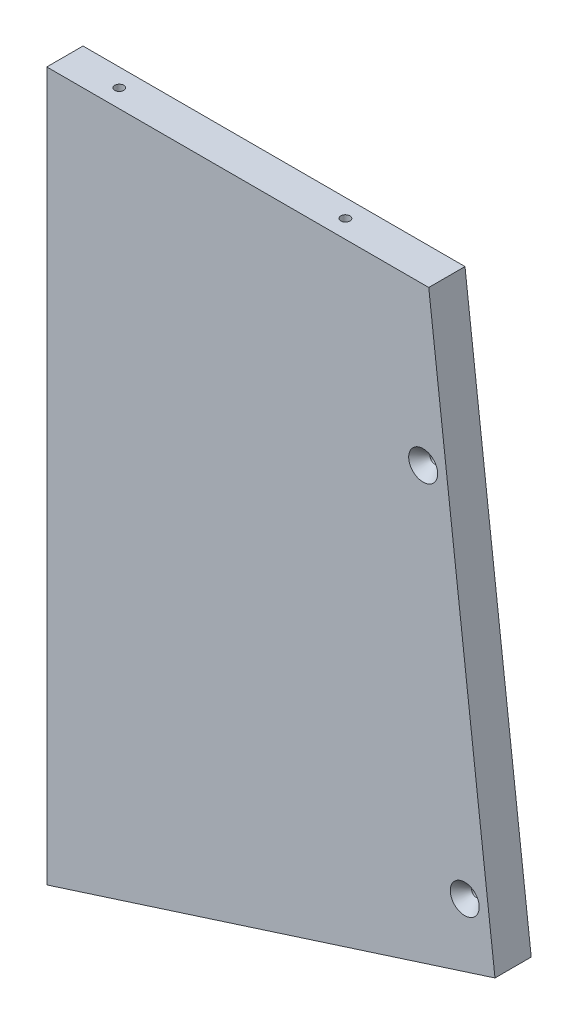
ISO-10303-21;
HEADER;
FILE_DESCRIPTION(('STEP AP214'),'2;1');
FILE_NAME('part.step','',(''),(''),'','','');
FILE_SCHEMA(('AUTOMOTIVE_DESIGN { 1 0 10303 214 1 1 1 1 }'));
ENDSEC;
DATA;
#1=APPLICATION_CONTEXT('core data for automotive mechanical design processes');
#2=APPLICATION_PROTOCOL_DEFINITION('international standard','automotive_design',2000,#1);
#3=PRODUCT_CONTEXT('',#1,'mechanical');
#4=PRODUCT('Part','Part','',(#3));
#5=PRODUCT_RELATED_PRODUCT_CATEGORY('part','',(#4));
#6=PRODUCT_DEFINITION_FORMATION('','',#4);
#7=PRODUCT_DEFINITION_CONTEXT('part definition',#1,'design');
#8=PRODUCT_DEFINITION('design','',#6,#7);
#9=PRODUCT_DEFINITION_SHAPE('','',#8);
#10=(LENGTH_UNIT() NAMED_UNIT(*) SI_UNIT(.MILLI.,.METRE.));
#11=(NAMED_UNIT(*) PLANE_ANGLE_UNIT() SI_UNIT($,.RADIAN.));
#12=(NAMED_UNIT(*) SI_UNIT($,.STERADIAN.) SOLID_ANGLE_UNIT());
#13=UNCERTAINTY_MEASURE_WITH_UNIT(LENGTH_MEASURE(1.E-05),#10,'distance_accuracy_value','');
#14=(GEOMETRIC_REPRESENTATION_CONTEXT(3) GLOBAL_UNCERTAINTY_ASSIGNED_CONTEXT((#13)) GLOBAL_UNIT_ASSIGNED_CONTEXT((#10,
#11,#12)) REPRESENTATION_CONTEXT('',''));
#15=CARTESIAN_POINT('',(0.,0.,0.));
#16=DIRECTION('',(0.,0.,1.));
#17=DIRECTION('',(1.,0.,0.));
#18=AXIS2_PLACEMENT_3D('',#15,#16,#17);
#19=CARTESIAN_POINT('',(-64.9774169834746,-197.96604829264,-12.7));
#20=DIRECTION('',(0.993195579602869,0.11645832154604,0.));
#21=DIRECTION('',(-0.11645832154604,0.993195579602869,0.));
#22=AXIS2_PLACEMENT_3D('',#19,#20,#21);
#23=PLANE('',#22);
#24=DIRECTION('',(-0.11645832154604,0.993195579602869,0.));
#25=VECTOR('',#24,1.);
#26=CARTESIAN_POINT('',(-64.9774169834746,-197.96604829264,0.));
#27=LINE('',#26,#25);
#28=CARTESIAN_POINT('',(-64.9774169834746,-197.96604829264,0.));
#29=VERTEX_POINT('',#28);
#30=CARTESIAN_POINT('',(-88.1901599524693,1.09287578986539E-13,0.));
#31=VERTEX_POINT('',#30);
#32=EDGE_CURVE('E160',#29,#31,#27,.T.);
#33=ORIENTED_EDGE('',*,*,#32,.F.);
#34=DIRECTION('',(0.,0.,1.));
#35=VECTOR('',#34,1.);
#36=CARTESIAN_POINT('',(-64.9774169834746,-197.96604829264,-12.7));
#37=LINE('',#36,#35);
#38=CARTESIAN_POINT('',(-64.9774169834746,-197.96604829264,-12.7));
#39=VERTEX_POINT('',#38);
#40=EDGE_CURVE('E41',#39,#29,#37,.T.);
#41=ORIENTED_EDGE('',*,*,#40,.F.);
#42=DIRECTION('',(-0.11645832154604,0.993195579602869,0.));
#43=VECTOR('',#42,1.);
#44=CARTESIAN_POINT('',(-64.9774169834746,-197.96604829264,-12.7));
#45=LINE('',#44,#43);
#46=CARTESIAN_POINT('',(-88.1901599524693,1.09287578986539E-13,-12.7));
#47=VERTEX_POINT('',#46);
#48=EDGE_CURVE('E150',#39,#47,#45,.T.);
#49=ORIENTED_EDGE('',*,*,#48,.T.);
#50=DIRECTION('',(0.,0.,1.));
#51=VECTOR('',#50,1.);
#52=CARTESIAN_POINT('',(-88.1901599524693,1.09287578986539E-13,-12.7));
#53=LINE('',#52,#51);
#54=EDGE_CURVE('E80',#47,#31,#53,.T.);
#55=ORIENTED_EDGE('',*,*,#54,.T.);
#56=EDGE_LOOP('',(#33,#41,#49,#55));
#57=FACE_BOUND('',#56,.T.);
#58=ADVANCED_FACE('F33',(#57),#23,.T.);
#59=CARTESIAN_POINT('',(-64.9774169834746,-197.96604829264,-12.7));
#60=DIRECTION('',(0.304884492171613,-0.952389335531041,0.));
#61=DIRECTION('',(0.952389335531041,0.304884492171613,0.));
#62=AXIS2_PLACEMENT_3D('',#59,#60,#61);
#63=PLANE('',#62);
#64=CARTESIAN_POINT('',(-104.122442077063,-210.497384639502,-6.35000000000019));
#65=DIRECTION('',(0.304884492171613,-0.952389335531041,0.));
#66=DIRECTION('',(0.952389335531041,0.304884492171613,0.));
#67=AXIS2_PLACEMENT_3D('',#64,#65,#66);
#68=CIRCLE('',#67,1.5875);
#69=CARTESIAN_POINT('',(-102.610524006908,-210.013380508179,-6.35000000000019));
#70=VERTEX_POINT('',#69);
#71=EDGE_CURVE('E36',#70,#70,#68,.T.);
#72=ORIENTED_EDGE('',*,*,#71,.F.);
#73=EDGE_LOOP('',(#72));
#74=FACE_BOUND('',#73,.T.);
#75=CARTESIAN_POINT('',(-197.286410666661,-240.321583832465,-6.35000000000022));
#76=DIRECTION('',(0.304884492171613,-0.952389335531041,0.));
#77=DIRECTION('',(0.952389335531041,0.304884492171613,0.));
#78=AXIS2_PLACEMENT_3D('',#75,#76,#77);
#79=CIRCLE('',#78,1.5875);
#80=CARTESIAN_POINT('',(-195.774492596505,-239.837579701142,-6.35000000000022));
#81=VERTEX_POINT('',#80);
#82=EDGE_CURVE('E117',#81,#81,#79,.T.);
#83=ORIENTED_EDGE('',*,*,#82,.F.);
#84=EDGE_LOOP('',(#83));
#85=FACE_BOUND('',#84,.T.);
#86=DIRECTION('',(0.952389335531041,0.304884492171613,0.));
#87=VECTOR('',#86,1.);
#88=CARTESIAN_POINT('',(-64.9774169834746,-197.96604829264,0.));
#89=LINE('',#88,#87);
#90=CARTESIAN_POINT('',(-222.05296718065,-248.249999999995,0.));
#91=VERTEX_POINT('',#90);
#92=EDGE_CURVE('E153',#91,#29,#89,.T.);
#93=ORIENTED_EDGE('',*,*,#92,.F.);
#94=DIRECTION('',(0.,0.,1.));
#95=VECTOR('',#94,1.);
#96=CARTESIAN_POINT('',(-222.05296718065,-248.249999999995,-12.7));
#97=LINE('',#96,#95);
#98=CARTESIAN_POINT('',(-222.05296718065,-248.249999999995,-12.7));
#99=VERTEX_POINT('',#98);
#100=EDGE_CURVE('E172',#99,#91,#97,.T.);
#101=ORIENTED_EDGE('',*,*,#100,.F.);
#102=DIRECTION('',(0.952389335531041,0.304884492171613,0.));
#103=VECTOR('',#102,1.);
#104=CARTESIAN_POINT('',(-64.9774169834746,-197.96604829264,-12.7));
#105=LINE('',#104,#103);
#106=EDGE_CURVE('E158',#99,#39,#105,.T.);
#107=ORIENTED_EDGE('',*,*,#106,.T.);
#108=ORIENTED_EDGE('',*,*,#40,.T.);
#109=EDGE_LOOP('',(#93,#101,#107,#108));
#110=FACE_BOUND('',#109,.T.);
#111=ADVANCED_FACE('F248',(#74,#85,#110),#63,.T.);
#112=CARTESIAN_POINT('',(-222.05296718065,-248.249999999995,-12.7));
#113=DIRECTION('',(-1.,0.,0.));
#114=DIRECTION('',(0.,-1.,0.));
#115=AXIS2_PLACEMENT_3D('',#112,#113,#114);
#116=PLANE('',#115);
#117=CARTESIAN_POINT('',(-222.05296718065,-227.298574490786,-6.35000000010183));
#118=DIRECTION('',(-1.,0.,0.));
#119=DIRECTION('',(0.,-1.,0.));
#120=AXIS2_PLACEMENT_3D('',#117,#118,#119);
#121=CIRCLE('',#120,1.58749999999999);
#122=CARTESIAN_POINT('',(-222.05296718065,-228.886074490786,-6.35000000010183));
#123=VERTEX_POINT('',#122);
#124=EDGE_CURVE('E145',#123,#123,#121,.T.);
#125=ORIENTED_EDGE('',*,*,#124,.F.);
#126=EDGE_LOOP('',(#125));
#127=FACE_BOUND('',#126,.T.);
#128=CARTESIAN_POINT('',(-222.05296718065,-55.2485744907911,-6.35000000010183));
#129=DIRECTION('',(-1.,0.,0.));
#130=DIRECTION('',(0.,-1.,0.));
#131=AXIS2_PLACEMENT_3D('',#128,#129,#130);
#132=CIRCLE('',#131,1.5875);
#133=CARTESIAN_POINT('',(-222.05296718065,-56.8360744907911,-6.35000000010183));
#134=VERTEX_POINT('',#133);
#135=EDGE_CURVE('E149',#134,#134,#132,.T.);
#136=ORIENTED_EDGE('',*,*,#135,.F.);
#137=EDGE_LOOP('',(#136));
#138=FACE_BOUND('',#137,.T.);
#139=DIRECTION('',(0.,-1.,0.));
#140=VECTOR('',#139,1.);
#141=CARTESIAN_POINT('',(-222.05296718065,-248.249999999995,0.));
#142=LINE('',#141,#140);
#143=CARTESIAN_POINT('',(-222.05296718065,0.,0.));
#144=VERTEX_POINT('',#143);
#145=EDGE_CURVE('E166',#144,#91,#142,.T.);
#146=ORIENTED_EDGE('',*,*,#145,.F.);
#147=DIRECTION('',(0.,0.,1.));
#148=VECTOR('',#147,1.);
#149=CARTESIAN_POINT('',(-222.05296718065,0.,-12.7));
#150=LINE('',#149,#148);
#151=CARTESIAN_POINT('',(-222.05296718065,0.,-12.7));
#152=VERTEX_POINT('',#151);
#153=EDGE_CURVE('E174',#152,#144,#150,.T.);
#154=ORIENTED_EDGE('',*,*,#153,.F.);
#155=DIRECTION('',(0.,-1.,0.));
#156=VECTOR('',#155,1.);
#157=CARTESIAN_POINT('',(-222.05296718065,-248.249999999995,-12.7));
#158=LINE('',#157,#156);
#159=EDGE_CURVE('E155',#152,#99,#158,.T.);
#160=ORIENTED_EDGE('',*,*,#159,.T.);
#161=ORIENTED_EDGE('',*,*,#100,.T.);
#162=EDGE_LOOP('',(#146,#154,#160,#161));
#163=FACE_BOUND('',#162,.T.);
#164=ADVANCED_FACE('F252',(#127,#138,#163),#116,.T.);
#165=CARTESIAN_POINT('',(-88.1901599524693,1.09287578986539E-13,-12.7));
#166=DIRECTION('',(0.,1.,0.));
#167=DIRECTION('',(-1.,0.,0.));
#168=AXIS2_PLACEMENT_3D('',#165,#166,#167);
#169=PLANE('',#168);
#170=CARTESIAN_POINT('',(-203.002967180666,0.,-6.34999999989857));
#171=DIRECTION('',(0.,1.,0.));
#172=DIRECTION('',(-1.,0.,0.));
#173=AXIS2_PLACEMENT_3D('',#170,#171,#172);
#174=CIRCLE('',#173,1.58749999999999);
#175=CARTESIAN_POINT('',(-204.590467180666,0.,-6.34999999989857));
#176=VERTEX_POINT('',#175);
#177=EDGE_CURVE('E123',#176,#176,#174,.T.);
#178=ORIENTED_EDGE('',*,*,#177,.F.);
#179=EDGE_LOOP('',(#178));
#180=FACE_BOUND('',#179,.T.);
#181=CARTESIAN_POINT('',(-123.747327392634,0.,-6.34999999989857));
#182=DIRECTION('',(0.,1.,0.));
#183=DIRECTION('',(-1.,0.,0.));
#184=AXIS2_PLACEMENT_3D('',#181,#182,#183);
#185=CIRCLE('',#184,1.5875);
#186=CARTESIAN_POINT('',(-125.334827392634,0.,-6.34999999989857));
#187=VERTEX_POINT('',#186);
#188=EDGE_CURVE('E127',#187,#187,#185,.T.);
#189=ORIENTED_EDGE('',*,*,#188,.F.);
#190=EDGE_LOOP('',(#189));
#191=FACE_BOUND('',#190,.T.);
#192=DIRECTION('',(-1.,0.,0.));
#193=VECTOR('',#192,1.);
#194=CARTESIAN_POINT('',(-88.1901599524693,1.09287578986539E-13,0.));
#195=LINE('',#194,#193);
#196=EDGE_CURVE('E163',#31,#144,#195,.T.);
#197=ORIENTED_EDGE('',*,*,#196,.F.);
#198=ORIENTED_EDGE('',*,*,#54,.F.);
#199=DIRECTION('',(-1.,0.,0.));
#200=VECTOR('',#199,1.);
#201=CARTESIAN_POINT('',(-88.1901599524693,1.09287578986539E-13,-12.7));
#202=LINE('',#201,#200);
#203=EDGE_CURVE('E152',#47,#152,#202,.T.);
#204=ORIENTED_EDGE('',*,*,#203,.T.);
#205=ORIENTED_EDGE('',*,*,#153,.T.);
#206=EDGE_LOOP('',(#197,#198,#204,#205));
#207=FACE_BOUND('',#206,.T.);
#208=ADVANCED_FACE('F263',(#180,#191,#207),#169,.T.);
#209=CARTESIAN_POINT('',(0.,0.,-12.7));
#210=DIRECTION('',(0.,0.,1.));
#211=DIRECTION('',(1.,0.,0.));
#212=AXIS2_PLACEMENT_3D('',#209,#210,#211);
#213=PLANE('',#212);
#214=CARTESIAN_POINT('',(-75.5766743949892,-179.246549529775,-12.7));
#215=DIRECTION('',(0.,0.,1.));
#216=DIRECTION('',(1.,0.,0.));
#217=AXIS2_PLACEMENT_3D('',#214,#215,#216);
#218=CIRCLE('',#217,1.5875);
#219=CARTESIAN_POINT('',(-73.9891743949892,-179.246549529775,-12.7));
#220=VERTEX_POINT('',#219);
#221=EDGE_CURVE('E134',#220,#220,#218,.T.);
#222=ORIENTED_EDGE('',*,*,#221,.T.);
#223=EDGE_LOOP('',(#222));
#224=FACE_BOUND('',#223,.T.);
#225=CARTESIAN_POINT('',(-90.1466019911812,-54.9893260736474,-12.7));
#226=DIRECTION('',(0.,0.,1.));
#227=DIRECTION('',(1.,0.,0.));
#228=AXIS2_PLACEMENT_3D('',#225,#226,#227);
#229=CIRCLE('',#228,1.5875);
#230=CARTESIAN_POINT('',(-88.5591019911813,-54.9893260736474,-12.7));
#231=VERTEX_POINT('',#230);
#232=EDGE_CURVE('E141',#231,#231,#229,.T.);
#233=ORIENTED_EDGE('',*,*,#232,.T.);
#234=EDGE_LOOP('',(#233));
#235=FACE_BOUND('',#234,.T.);
#236=ORIENTED_EDGE('',*,*,#48,.F.);
#237=ORIENTED_EDGE('',*,*,#106,.F.);
#238=ORIENTED_EDGE('',*,*,#159,.F.);
#239=ORIENTED_EDGE('',*,*,#203,.F.);
#240=EDGE_LOOP('',(#236,#237,#238,#239));
#241=FACE_BOUND('',#240,.T.);
#242=ADVANCED_FACE('F262',(#224,#235,#241),#213,.F.);
#243=CARTESIAN_POINT('',(0.,0.,0.));
#244=DIRECTION('',(0.,0.,1.));
#245=DIRECTION('',(1.,0.,0.));
#246=AXIS2_PLACEMENT_3D('',#243,#244,#245);
#247=PLANE('',#246);
#248=CARTESIAN_POINT('',(-75.5766743949892,-179.246549529775,3.69322628035462E-12));
#249=DIRECTION('',(0.,0.,1.));
#250=DIRECTION('',(1.,0.,0.));
#251=AXIS2_PLACEMENT_3D('',#248,#249,#250);
#252=CIRCLE('',#251,5.08);
#253=CARTESIAN_POINT('',(-70.4966743949892,-179.246549529775,3.6932262803426E-12));
#254=VERTEX_POINT('',#253);
#255=EDGE_CURVE('E128',#254,#254,#252,.T.);
#256=ORIENTED_EDGE('',*,*,#255,.F.);
#257=EDGE_LOOP('',(#256));
#258=FACE_BOUND('',#257,.T.);
#259=CARTESIAN_POINT('',(-90.1466019911812,-54.9893260736474,3.69322628035462E-12));
#260=DIRECTION('',(0.,0.,1.));
#261=DIRECTION('',(1.,0.,0.));
#262=AXIS2_PLACEMENT_3D('',#259,#260,#261);
#263=CIRCLE('',#262,5.08);
#264=CARTESIAN_POINT('',(-85.0666019911812,-54.9893260736474,3.6932262803426E-12));
#265=VERTEX_POINT('',#264);
#266=EDGE_CURVE('E135',#265,#265,#263,.T.);
#267=ORIENTED_EDGE('',*,*,#266,.F.);
#268=EDGE_LOOP('',(#267));
#269=FACE_BOUND('',#268,.T.);
#270=ORIENTED_EDGE('',*,*,#32,.T.);
#271=ORIENTED_EDGE('',*,*,#196,.T.);
#272=ORIENTED_EDGE('',*,*,#145,.T.);
#273=ORIENTED_EDGE('',*,*,#92,.T.);
#274=EDGE_LOOP('',(#270,#271,#272,#273));
#275=FACE_BOUND('',#274,.T.);
#276=ADVANCED_FACE('F256',(#258,#269,#275),#247,.T.);
#277=CARTESIAN_POINT('',(-203.002967180657,-55.2485744907911,-6.35000000010183));
#278=DIRECTION('',(-1.,0.,0.));
#279=DIRECTION('',(0.,0.,1.));
#280=AXIS2_PLACEMENT_3D('',#277,#278,#279);
#281=CONICAL_SURFACE('',#280,1.5875,1.02974425867666);
#282=CARTESIAN_POINT('',(-202.04910094795,-55.2485744907911,-6.35000000010183));
#283=VERTEX_POINT('',#282);
#284=VERTEX_LOOP('',#283);
#285=FACE_BOUND('',#284,.T.);
#286=CARTESIAN_POINT('',(-203.002967180657,-55.2485744907911,-6.35000000010183));
#287=DIRECTION('',(-1.,0.,0.));
#288=DIRECTION('',(0.,0.,1.));
#289=AXIS2_PLACEMENT_3D('',#286,#287,#288);
#290=CIRCLE('',#289,1.5875);
#291=CARTESIAN_POINT('',(-203.002967180657,-55.2485744907911,-4.76250000010183));
#292=VERTEX_POINT('',#291);
#293=EDGE_CURVE('E146',#292,#292,#290,.T.);
#294=ORIENTED_EDGE('',*,*,#293,.T.);
#295=EDGE_LOOP('',(#294));
#296=FACE_BOUND('',#295,.T.);
#297=ADVANCED_FACE('F278',(#285,#296),#281,.F.);
#298=CARTESIAN_POINT('',(-234.752967180657,-55.2485744907911,-6.35000000010183));
#299=DIRECTION('',(-1.,0.,0.));
#300=DIRECTION('',(0.,0.,1.));
#301=AXIS2_PLACEMENT_3D('',#298,#299,#300);
#302=CYLINDRICAL_SURFACE('',#301,1.5875);
#303=ORIENTED_EDGE('',*,*,#135,.T.);
#304=EDGE_LOOP('',(#303));
#305=FACE_BOUND('',#304,.T.);
#306=ORIENTED_EDGE('',*,*,#293,.F.);
#307=EDGE_LOOP('',(#306));
#308=FACE_BOUND('',#307,.T.);
#309=ADVANCED_FACE('F244',(#305,#308),#302,.F.);
#310=CARTESIAN_POINT('',(-203.002967180657,-227.298574490786,-6.35000000010183));
#311=DIRECTION('',(-1.,0.,0.));
#312=DIRECTION('',(0.,0.,1.));
#313=AXIS2_PLACEMENT_3D('',#310,#311,#312);
#314=CONICAL_SURFACE('',#313,1.58749999999999,1.02974425867666);
#315=CARTESIAN_POINT('',(-203.002967180657,-227.298574490786,-6.35000000010183));
#316=DIRECTION('',(-1.,0.,0.));
#317=DIRECTION('',(0.,0.,1.));
#318=AXIS2_PLACEMENT_3D('',#315,#316,#317);
#319=CIRCLE('',#318,1.58749999999999);
#320=CARTESIAN_POINT('',(-203.002967180657,-226.169069251702,-7.46551520164904));
#321=VERTEX_POINT('',#320);
#322=CARTESIAN_POINT('',(-203.002967180657,-226.169069251856,-5.23448479839888));
#323=VERTEX_POINT('',#322);
#324=EDGE_CURVE('E142',#321,#323,#319,.T.);
#325=ORIENTED_EDGE('',*,*,#324,.T.);
#326=CARTESIAN_POINT('',(-203.702174502647,-224.681434805405,-5.50173621414572));
#327=CARTESIAN_POINT('',(-203.671882140085,-224.740062831933,-5.4843834623303));
#328=CARTESIAN_POINT('',(-203.641634171266,-224.798981739055,-5.46796480075559));
#329=CARTESIAN_POINT('',(-203.581332205078,-224.917362370675,-5.43683306081639));
#330=CARTESIAN_POINT('',(-203.551278194756,-224.976824058272,-5.42211986742294));
#331=CARTESIAN_POINT('',(-203.461483659005,-225.156126702263,-5.38025632363283));
#332=CARTESIAN_POINT('',(-203.402187173947,-225.276737923705,-5.35542474407895));
#333=CARTESIAN_POINT('',(-203.283719534908,-225.524302257082,-5.31063305603742));
#334=CARTESIAN_POINT('',(-203.224626391775,-225.651329097138,-5.29087538838373));
#335=CARTESIAN_POINT('',(-203.110341518138,-225.907905345652,-5.25764741215892));
#336=CARTESIAN_POINT('',(-203.05514762677,-226.037453305385,-5.24417359767703));
#337=CARTESIAN_POINT('',(-202.971288357022,-226.248973518742,-5.2286027256776));
#338=CARTESIAN_POINT('',(-202.940618169246,-226.329970305322,-5.22412109413907));
#339=CARTESIAN_POINT('',(-202.882550923448,-226.493294756323,-5.21867123828132));
#340=CARTESIAN_POINT('',(-202.855154699599,-226.575622753883,-5.21770390753189));
#341=CARTESIAN_POINT('',(-202.804964426969,-226.740803450159,-5.22022239338786));
#342=CARTESIAN_POINT('',(-202.782129809237,-226.823644079057,-5.22366672956401));
#343=CARTESIAN_POINT('',(-202.74196973647,-226.990187564825,-5.23624832117197));
#344=CARTESIAN_POINT('',(-202.724638765351,-227.073889471026,-5.24537984919709));
#345=CARTESIAN_POINT('',(-202.694991175343,-227.25040640836,-5.27236998963508));
#346=CARTESIAN_POINT('',(-202.683418442645,-227.343229165748,-5.29106476177787));
#347=CARTESIAN_POINT('',(-202.668743872238,-227.526651269224,-5.33989231848737));
#348=CARTESIAN_POINT('',(-202.665643311415,-227.617250278119,-5.37002682641751));
#349=CARTESIAN_POINT('',(-202.666574085596,-227.779287271133,-5.4381340410203));
#350=CARTESIAN_POINT('',(-202.669583846205,-227.851531917636,-5.47419386654976));
#351=CARTESIAN_POINT('',(-202.679185884636,-227.989406486947,-5.55704185315341));
#352=CARTESIAN_POINT('',(-202.685774926665,-228.055042320915,-5.60382030217532));
#353=CARTESIAN_POINT('',(-202.698487976409,-228.159768177848,-5.69446862956715));
#354=CARTESIAN_POINT('',(-202.704249741128,-228.201218985836,-5.73565976057363));
#355=CARTESIAN_POINT('',(-202.715691405799,-228.277080747177,-5.82410192213683));
#356=CARTESIAN_POINT('',(-202.721371419979,-228.31150264016,-5.87134334676477));
#357=CARTESIAN_POINT('',(-202.730751455728,-228.365696800984,-5.96212465739611));
#358=CARTESIAN_POINT('',(-202.734623327824,-228.387001921108,-6.00472696415562));
#359=CARTESIAN_POINT('',(-202.741198380665,-228.422358562626,-6.09294662428638));
#360=CARTESIAN_POINT('',(-202.743902313442,-228.436414752715,-6.13856201565874));
#361=CARTESIAN_POINT('',(-202.747764902578,-228.456319545268,-6.23191418196803));
#362=CARTESIAN_POINT('',(-202.748914718344,-228.462121201568,-6.27966151046818));
#363=CARTESIAN_POINT('',(-202.749456559004,-228.464867940394,-6.37541755683359));
#364=CARTESIAN_POINT('',(-202.748849015494,-228.461815197496,-6.42342620762953));
#365=CARTESIAN_POINT('',(-202.746109284837,-228.447806430887,-6.51368486120082));
#366=CARTESIAN_POINT('',(-202.744121954289,-228.437600487534,-6.55605934788765));
#367=CARTESIAN_POINT('',(-202.739031777949,-228.410781679436,-6.63864205177699));
#368=CARTESIAN_POINT('',(-202.735928548395,-228.394166610412,-6.67884951825144));
#369=CARTESIAN_POINT('',(-202.727872243592,-228.349402965441,-6.76840749169664));
#370=CARTESIAN_POINT('',(-202.722643865879,-228.319276951969,-6.81674405854242));
#371=CARTESIAN_POINT('',(-202.711732151768,-228.251554748664,-6.90781292710091));
#372=CARTESIAN_POINT('',(-202.706047966582,-228.21394441945,-6.95053436308987));
#373=CARTESIAN_POINT('',(-202.693252316778,-228.119517262053,-7.04348469928379));
#374=CARTESIAN_POINT('',(-202.68629672243,-228.060477327024,-7.09146878233046));
#375=CARTESIAN_POINT('',(-202.674926824294,-227.935430909277,-7.17759619814822));
#376=CARTESIAN_POINT('',(-202.67051513707,-227.869417335999,-7.21572937649036));
#377=CARTESIAN_POINT('',(-202.666557724059,-227.756575969099,-7.27125189159323));
#378=CARTESIAN_POINT('',(-202.665854924555,-227.711036269471,-7.2912484224853));
#379=CARTESIAN_POINT('',(-202.666471533522,-227.618541523192,-7.32764944758451));
#380=CARTESIAN_POINT('',(-202.667791450457,-227.571586123574,-7.34405303742232));
#381=CARTESIAN_POINT('',(-202.672655492538,-227.476749644592,-7.37355713589845));
#382=CARTESIAN_POINT('',(-202.676200557454,-227.4288681824,-7.38665624564334));
#383=CARTESIAN_POINT('',(-202.685584694135,-227.332603769758,-7.40986975798014));
#384=CARTESIAN_POINT('',(-202.691424475905,-227.284220668614,-7.41998323509364));
#385=CARTESIAN_POINT('',(-202.708954409323,-227.162282451445,-7.44210094687146));
#386=CARTESIAN_POINT('',(-202.722108454465,-227.088623725297,-7.45238705184344));
#387=CARTESIAN_POINT('',(-202.753039710045,-226.941750506568,-7.46804180839348));
#388=CARTESIAN_POINT('',(-202.770820343927,-226.868536384198,-7.47340680523891));
#389=CARTESIAN_POINT('',(-202.810227499769,-226.722878675096,-7.48023071180756));
#390=CARTESIAN_POINT('',(-202.831859573835,-226.65043636293,-7.48168393303795));
#391=CARTESIAN_POINT('',(-202.878151474976,-226.506575758748,-7.48145921694546));
#392=CARTESIAN_POINT('',(-202.902810276577,-226.435157129009,-7.47978233740071));
#393=CARTESIAN_POINT('',(-202.940604092494,-226.331398291711,-7.47545496170002));
#394=CARTESIAN_POINT('',(-202.952815551905,-226.298670392131,-7.47381104221931));
#395=CARTESIAN_POINT('',(-202.977675249719,-226.233451986106,-7.47001482438733));
#396=CARTESIAN_POINT('',(-202.990322989882,-226.200961257057,-7.46786309056331));
#397=CARTESIAN_POINT('',(-203.055957983115,-226.03541244084,-7.45567536022711));
#398=CARTESIAN_POINT('',(-203.112067397104,-225.903852764911,-7.44193159603914));
#399=CARTESIAN_POINT('',(-203.228283041606,-225.643305064162,-7.40797712245783));
#400=CARTESIAN_POINT('',(-203.288392340848,-225.514319114868,-7.38776140136277));
#401=CARTESIAN_POINT('',(-203.411026491763,-225.258505472955,-7.34105592788049));
#402=CARTESIAN_POINT('',(-203.473553497866,-225.131679857448,-7.31456046648882));
#403=CARTESIAN_POINT('',(-203.599815332915,-224.880344332425,-7.25468399530443));
#404=CARTESIAN_POINT('',(-203.66354934231,-224.755832957865,-7.2213075155027));
#405=CARTESIAN_POINT('',(-203.745990550789,-224.596853144276,-7.1726031730336));
#406=CARTESIAN_POINT('',(-203.764598882745,-224.561105149917,-7.16124687740552));
#407=CARTESIAN_POINT('',(-203.801788013397,-224.489909087743,-7.13772459116559));
#408=CARTESIAN_POINT('',(-203.820368821506,-224.454460768788,-7.1255593745473));
#409=CARTESIAN_POINT('',(-203.838930527188,-224.419159811558,-7.11294259924632));
#410=B_SPLINE_CURVE_WITH_KNOTS('',3,(#326,#327,#328,#329,#330,#331,#332,#333,#334,#335,#336,
#337,#338,#339,#340,#341,#342,#343,#344,#345,#346,#347,#348,#349,#350,#351,#352,#353,#354,#355,
#356,#357,#358,#359,#360,#361,#362,#363,#364,#365,#366,#367,#368,#369,#370,#371,#372,#373,#374,
#375,#376,#377,#378,#379,#380,#381,#382,#383,#384,#385,#386,#387,#388,#389,#390,#391,#392,#393,
#394,#395,#396,#397,#398,#399,#400,#401,#402,#403,#404,#405,#406,#407,#408,#409),.UNSPECIFIED.,
.F.,.F.,(4,2,2,2,2,2,2,2,2,2,2,2,2,2,2,2,2,2,2,2,2,2,2,2,2,2,2,2,2,2,2,2,2,2,2,2,2,2,2,2,2,4),
(0.,0.204685318926715,0.409356824369475,0.819213546234241,1.2435094660193,1.66756837701208,
1.92763731148414,2.18777236820805,2.44547938125762,2.70292728373839,2.98818507719391,
3.27348586098286,3.51499830307834,3.75629277217297,3.93185864112269,4.10714914526896,
4.24994069532644,4.39264016482456,4.53614801123067,4.67962061613671,4.80994221945871,
4.94030868409829,5.11095913779308,5.28193509875822,5.50990695141478,5.73811287080027,
5.88715764419352,6.0362398902347,6.18538514210854,6.3345765772014,6.5607680137287,
6.78712729893218,7.01381557777731,7.24042726404355,7.3453334083549,7.45012347538908,
7.88082026473901,8.31185138360848,8.74327587252903,9.17441724291722,9.30002205835424,
9.42550837515862),.UNSPECIFIED.);
#411=EDGE_CURVE('E11',#323,#321,#410,.T.);
#412=ORIENTED_EDGE('',*,*,#411,.T.);
#413=EDGE_LOOP('',(#325,#412));
#414=FACE_BOUND('',#413,.T.);
#415=ADVANCED_FACE('F194',(#414),#314,.F.);
#416=CARTESIAN_POINT('',(-234.752967180657,-227.298574490786,-6.35000000010183));
#417=DIRECTION('',(-1.,0.,0.));
#418=DIRECTION('',(0.,0.,1.));
#419=AXIS2_PLACEMENT_3D('',#416,#417,#418);
#420=CYLINDRICAL_SURFACE('',#419,1.58749999999999);
#421=ORIENTED_EDGE('',*,*,#124,.T.);
#422=EDGE_LOOP('',(#421));
#423=FACE_BOUND('',#422,.T.);
#424=ORIENTED_EDGE('',*,*,#324,.F.);
#425=CARTESIAN_POINT('',(-201.455413238986,-227.298574490786,-6.35000000005102));
#426=DIRECTION('',(-0.589540290323056,-0.80773897150367,0.));
#427=DIRECTION('',(-0.80773897150367,0.589540290323056,0.));
#428=AXIS2_PLACEMENT_3D('',#425,#426,#427);
#429=ELLIPSE('',#428,2.6927760936069,1.5875);
#430=EDGE_CURVE('E47',#321,#323,#429,.F.);
#431=ORIENTED_EDGE('',*,*,#430,.T.);
#432=EDGE_LOOP('',(#424,#431));
#433=FACE_BOUND('',#432,.T.);
#434=ADVANCED_FACE('F237',(#423,#433),#420,.F.);
#435=CARTESIAN_POINT('',(-90.1466019911812,-54.9893260736474,3.69149155687865E-12));
#436=DIRECTION('',(0.,0.,1.));
#437=DIRECTION('',(1.,0.,0.));
#438=AXIS2_PLACEMENT_3D('',#435,#436,#437);
#439=CYLINDRICAL_SURFACE('',#438,1.5875);
#440=CARTESIAN_POINT('',(-90.1466019911812,-54.9893260736474,-4.01766166221567));
#441=DIRECTION('',(0.,0.,1.));
#442=DIRECTION('',(1.,0.,0.));
#443=AXIS2_PLACEMENT_3D('',#440,#441,#442);
#444=CIRCLE('',#443,1.58749999999999);
#445=CARTESIAN_POINT('',(-88.5591019911813,-54.9893260736474,-4.01766166221567));
#446=VERTEX_POINT('',#445);
#447=EDGE_CURVE('E138',#446,#446,#444,.T.);
#448=ORIENTED_EDGE('',*,*,#447,.T.);
#449=EDGE_LOOP('',(#448));
#450=FACE_BOUND('',#449,.T.);
#451=ORIENTED_EDGE('',*,*,#232,.F.);
#452=EDGE_LOOP('',(#451));
#453=FACE_BOUND('',#452,.T.);
#454=ADVANCED_FACE('F234',(#450,#453),#439,.F.);
#455=CARTESIAN_POINT('',(-90.1466019911812,-54.9893260736474,3.69322628035462E-12));
#456=DIRECTION('',(0.,0.,1.));
#457=DIRECTION('',(1.,0.,0.));
#458=AXIS2_PLACEMENT_3D('',#455,#456,#457);
#459=CONICAL_SURFACE('',#458,5.08,0.715584993317678);
#460=CARTESIAN_POINT('',(-88.5591019911813,-54.9893260736474,-4.01766166221567));
#461=CARTESIAN_POINT('',(-88.5227217828479,-54.9893260736474,-3.97581101990089));
#462=CARTESIAN_POINT('',(-88.4863415745146,-54.9893260736474,-3.9339603775861));
#463=CARTESIAN_POINT('',(-88.4135811578479,-54.9893260736474,-3.85025909295653));
#464=CARTESIAN_POINT('',(-88.3772009495146,-54.9893260736474,-3.80840845064174));
#465=CARTESIAN_POINT('',(-88.3044405328479,-54.9893260736474,-3.72470716601218));
#466=CARTESIAN_POINT('',(-88.2680603245146,-54.9893260736474,-3.68285652369739));
#467=CARTESIAN_POINT('',(-88.1952999078479,-54.9893260736474,-3.59915523906782));
#468=CARTESIAN_POINT('',(-88.1589196995146,-54.9893260736474,-3.55730459675304));
#469=CARTESIAN_POINT('',(-88.0861592828479,-54.9893260736474,-3.47360331212347));
#470=CARTESIAN_POINT('',(-88.0497790745146,-54.9893260736474,-3.43175266980868));
#471=CARTESIAN_POINT('',(-87.9770186578479,-54.9893260736474,-3.34805138517911));
#472=CARTESIAN_POINT('',(-87.9406384495146,-54.9893260736474,-3.30620074286433));
#473=CARTESIAN_POINT('',(-87.8678780328479,-54.9893260736474,-3.22249945823475));
#474=CARTESIAN_POINT('',(-87.8314978245146,-54.9893260736474,-3.18064881591997));
#475=CARTESIAN_POINT('',(-87.7587374078479,-54.9893260736474,-3.0969475312904));
#476=CARTESIAN_POINT('',(-87.7223571995146,-54.9893260736474,-3.05509688897562));
#477=CARTESIAN_POINT('',(-87.6495967828479,-54.9893260736474,-2.97139560434605));
#478=CARTESIAN_POINT('',(-87.6132165745146,-54.9893260736474,-2.92954496203126));
#479=CARTESIAN_POINT('',(-87.5404561578479,-54.9893260736474,-2.84584367740169));
#480=CARTESIAN_POINT('',(-87.5040759495146,-54.9893260736474,-2.8039930350869));
#481=CARTESIAN_POINT('',(-87.4313155328479,-54.9893260736474,-2.72029175045733));
#482=CARTESIAN_POINT('',(-87.3949353245146,-54.9893260736474,-2.67844110814255));
#483=CARTESIAN_POINT('',(-87.3221749078479,-54.9893260736474,-2.59473982351298));
#484=CARTESIAN_POINT('',(-87.2857946995146,-54.9893260736474,-2.55288918119819));
#485=CARTESIAN_POINT('',(-87.2130342828479,-54.9893260736474,-2.46918789656863));
#486=CARTESIAN_POINT('',(-87.1766540745146,-54.9893260736474,-2.42733725425384));
#487=CARTESIAN_POINT('',(-87.1038936578479,-54.9893260736474,-2.34363596962427));
#488=CARTESIAN_POINT('',(-87.0675134495146,-54.9893260736474,-2.30178532730948));
#489=CARTESIAN_POINT('',(-86.9947530328479,-54.9893260736474,-2.21808404267991));
#490=CARTESIAN_POINT('',(-86.9583728245146,-54.9893260736474,-2.17623340036513));
#491=CARTESIAN_POINT('',(-86.8856124078479,-54.9893260736474,-2.09253211573556));
#492=CARTESIAN_POINT('',(-86.8492321995146,-54.9893260736474,-2.05068147342077));
#493=CARTESIAN_POINT('',(-86.7764717828479,-54.9893260736474,-1.9669801887912));
#494=CARTESIAN_POINT('',(-86.7400915745146,-54.9893260736474,-1.92512954647642));
#495=CARTESIAN_POINT('',(-86.6673311578479,-54.9893260736474,-1.84142826184685));
#496=CARTESIAN_POINT('',(-86.6309509495146,-54.9893260736474,-1.79957761953207));
#497=CARTESIAN_POINT('',(-86.5581905328479,-54.9893260736474,-1.71587633490249));
#498=CARTESIAN_POINT('',(-86.5218103245146,-54.9893260736474,-1.67402569258771));
#499=CARTESIAN_POINT('',(-86.4490499078479,-54.9893260736474,-1.59032440795814));
#500=CARTESIAN_POINT('',(-86.4126696995146,-54.9893260736474,-1.54847376564335));
#501=CARTESIAN_POINT('',(-86.3399092828479,-54.9893260736474,-1.46477248101378));
#502=CARTESIAN_POINT('',(-86.3035290745146,-54.9893260736474,-1.422921838699));
#503=CARTESIAN_POINT('',(-86.2307686578479,-54.9893260736474,-1.33922055406943));
#504=CARTESIAN_POINT('',(-86.1943884495146,-54.9893260736474,-1.29736991175464));
#505=CARTESIAN_POINT('',(-86.1216280328479,-54.9893260736474,-1.21366862712507));
#506=CARTESIAN_POINT('',(-86.0852478245146,-54.9893260736474,-1.17181798481029));
#507=CARTESIAN_POINT('',(-86.0124874078479,-54.9893260736474,-1.08811670018072));
#508=CARTESIAN_POINT('',(-85.9761071995146,-54.9893260736474,-1.04626605786593));
#509=CARTESIAN_POINT('',(-85.9033467828479,-54.9893260736474,-0.962564773236363));
#510=CARTESIAN_POINT('',(-85.8669665745146,-54.9893260736474,-0.920714130921577));
#511=CARTESIAN_POINT('',(-85.7942061578479,-54.9893260736474,-0.837012846292008));
#512=CARTESIAN_POINT('',(-85.7578259495146,-54.9893260736474,-0.795162203977224));
#513=CARTESIAN_POINT('',(-85.6850655328479,-54.9893260736474,-0.711460919347653));
#514=CARTESIAN_POINT('',(-85.6486853245146,-54.9893260736474,-0.669610277032867));
#515=CARTESIAN_POINT('',(-85.5759249078479,-54.9893260736474,-0.585908992403296));
#516=CARTESIAN_POINT('',(-85.5395446995146,-54.9893260736474,-0.544058350088512));
#517=CARTESIAN_POINT('',(-85.4667842828479,-54.9893260736474,-0.460357065458943));
#518=CARTESIAN_POINT('',(-85.4304040745146,-54.9893260736474,-0.418506423144159));
#519=CARTESIAN_POINT('',(-85.3576436578479,-54.9893260736474,-0.334805138514588));
#520=CARTESIAN_POINT('',(-85.3212634495146,-54.9893260736474,-0.292954496199802));
#521=CARTESIAN_POINT('',(-85.2485030328479,-54.9893260736474,-0.209253211570231));
#522=CARTESIAN_POINT('',(-85.2121228245146,-54.9893260736474,-0.167402569255446));
#523=CARTESIAN_POINT('',(-85.1393624078479,-54.9893260736474,-0.0837012846258777));
#524=CARTESIAN_POINT('',(-85.1029821995146,-54.9893260736474,-0.0418506423110934));
#525=CARTESIAN_POINT('',(-85.0666019911812,-54.9893260736474,3.69322628035462E-12));
#526=B_SPLINE_CURVE_WITH_KNOTS('',3,(#460,#461,#462,#463,#464,#465,#466,#467,#468,#469,#470,
#471,#472,#473,#474,#475,#476,#477,#478,#479,#480,#481,#482,#483,#484,#485,#486,#487,#488,#489,
#490,#491,#492,#493,#494,#495,#496,#497,#498,#499,#500,#501,#502,#503,#504,#505,#506,#507,#508,
#509,#510,#511,#512,#513,#514,#515,#516,#517,#518,#519,#520,#521,#522,#523,#524,#525),
.UNSPECIFIED.,.F.,.F.,(4,2,2,2,2,2,2,2,2,2,2,2,2,2,2,2,2,2,2,2,2,2,2,2,2,2,2,2,2,2,2,2,4),(0.,
0.166357934541254,0.332715869082499,0.499073803623753,0.665431738165007,0.831789672706261,
0.998147607247506,1.16450554178876,1.33086347633001,1.49722141087127,1.66357934541251,
1.82993727995377,1.99629521449502,2.16265314903627,2.32901108357752,2.49536901811877,
2.66172695266003,2.82808488720128,2.99444282174254,3.16080075628378,3.32715869082503,
3.49351662536629,3.65987455990753,3.82623249444879,3.99259042899004,4.15894836353129,
4.32530629807255,4.49166423261379,4.65802216715505,4.8243801016963,4.99073803623755,
5.1570959707788,5.32345390532005),.UNSPECIFIED.);
#527=EDGE_CURVE('BSEAM230',#446,#265,#526,.T.);
#528=ORIENTED_EDGE('',*,*,#447,.F.);
#529=ORIENTED_EDGE('',*,*,#266,.T.);
#530=ORIENTED_EDGE('',*,*,#527,.T.);
#531=ORIENTED_EDGE('',*,*,#527,.F.);
#532=EDGE_LOOP('',(#528,#530,#529,#531));
#533=FACE_BOUND('',#532,.T.);
#534=ADVANCED_FACE('F230',(#533),#459,.F.);
#535=CARTESIAN_POINT('',(-75.5766743949892,-179.246549529775,3.69149155687865E-12));
#536=DIRECTION('',(0.,0.,1.));
#537=DIRECTION('',(1.,0.,0.));
#538=AXIS2_PLACEMENT_3D('',#535,#536,#537);
#539=CYLINDRICAL_SURFACE('',#538,1.5875);
#540=CARTESIAN_POINT('',(-75.5766743949892,-179.246549529775,-4.01766166221567));
#541=DIRECTION('',(0.,0.,1.));
#542=DIRECTION('',(1.,0.,0.));
#543=AXIS2_PLACEMENT_3D('',#540,#541,#542);
#544=CIRCLE('',#543,1.58749999999999);
#545=CARTESIAN_POINT('',(-73.9891743949892,-179.246549529775,-4.01766166221567));
#546=VERTEX_POINT('',#545);
#547=EDGE_CURVE('E131',#546,#546,#544,.T.);
#548=ORIENTED_EDGE('',*,*,#547,.T.);
#549=EDGE_LOOP('',(#548));
#550=FACE_BOUND('',#549,.T.);
#551=ORIENTED_EDGE('',*,*,#221,.F.);
#552=EDGE_LOOP('',(#551));
#553=FACE_BOUND('',#552,.T.);
#554=ADVANCED_FACE('F226',(#550,#553),#539,.F.);
#555=CARTESIAN_POINT('',(-75.5766743949892,-179.246549529775,3.69322628035462E-12));
#556=DIRECTION('',(0.,0.,1.));
#557=DIRECTION('',(1.,0.,0.));
#558=AXIS2_PLACEMENT_3D('',#555,#556,#557);
#559=CONICAL_SURFACE('',#558,5.08,0.715584993317678);
#560=CARTESIAN_POINT('',(-73.9891743949892,-179.246549529775,-4.01766166221567));
#561=CARTESIAN_POINT('',(-73.9527941866558,-179.246549529775,-3.97581101990089));
#562=CARTESIAN_POINT('',(-73.9164139783225,-179.246549529775,-3.9339603775861));
#563=CARTESIAN_POINT('',(-73.8436535616558,-179.246549529775,-3.85025909295653));
#564=CARTESIAN_POINT('',(-73.8072733533225,-179.246549529775,-3.80840845064174));
#565=CARTESIAN_POINT('',(-73.7345129366558,-179.246549529775,-3.72470716601218));
#566=CARTESIAN_POINT('',(-73.6981327283225,-179.246549529775,-3.68285652369739));
#567=CARTESIAN_POINT('',(-73.6253723116558,-179.246549529775,-3.59915523906782));
#568=CARTESIAN_POINT('',(-73.5889921033225,-179.246549529775,-3.55730459675304));
#569=CARTESIAN_POINT('',(-73.5162316866558,-179.246549529775,-3.47360331212347));
#570=CARTESIAN_POINT('',(-73.4798514783225,-179.246549529775,-3.43175266980868));
#571=CARTESIAN_POINT('',(-73.4070910616558,-179.246549529775,-3.34805138517911));
#572=CARTESIAN_POINT('',(-73.3707108533225,-179.246549529775,-3.30620074286433));
#573=CARTESIAN_POINT('',(-73.2979504366558,-179.246549529775,-3.22249945823475));
#574=CARTESIAN_POINT('',(-73.2615702283225,-179.246549529775,-3.18064881591997));
#575=CARTESIAN_POINT('',(-73.1888098116558,-179.246549529775,-3.0969475312904));
#576=CARTESIAN_POINT('',(-73.1524296033225,-179.246549529775,-3.05509688897562));
#577=CARTESIAN_POINT('',(-73.0796691866558,-179.246549529775,-2.97139560434605));
#578=CARTESIAN_POINT('',(-73.0432889783225,-179.246549529775,-2.92954496203126));
#579=CARTESIAN_POINT('',(-72.9705285616558,-179.246549529775,-2.84584367740169));
#580=CARTESIAN_POINT('',(-72.9341483533225,-179.246549529775,-2.8039930350869));
#581=CARTESIAN_POINT('',(-72.8613879366558,-179.246549529775,-2.72029175045733));
#582=CARTESIAN_POINT('',(-72.8250077283225,-179.246549529775,-2.67844110814255));
#583=CARTESIAN_POINT('',(-72.7522473116558,-179.246549529775,-2.59473982351298));
#584=CARTESIAN_POINT('',(-72.7158671033225,-179.246549529775,-2.55288918119819));
#585=CARTESIAN_POINT('',(-72.6431066866558,-179.246549529775,-2.46918789656863));
#586=CARTESIAN_POINT('',(-72.6067264783225,-179.246549529775,-2.42733725425384));
#587=CARTESIAN_POINT('',(-72.5339660616558,-179.246549529775,-2.34363596962427));
#588=CARTESIAN_POINT('',(-72.4975858533225,-179.246549529775,-2.30178532730948));
#589=CARTESIAN_POINT('',(-72.4248254366558,-179.246549529775,-2.21808404267991));
#590=CARTESIAN_POINT('',(-72.3884452283225,-179.246549529775,-2.17623340036513));
#591=CARTESIAN_POINT('',(-72.3156848116558,-179.246549529775,-2.09253211573556));
#592=CARTESIAN_POINT('',(-72.2793046033225,-179.246549529775,-2.05068147342077));
#593=CARTESIAN_POINT('',(-72.2065441866558,-179.246549529775,-1.9669801887912));
#594=CARTESIAN_POINT('',(-72.1701639783225,-179.246549529775,-1.92512954647642));
#595=CARTESIAN_POINT('',(-72.0974035616558,-179.246549529775,-1.84142826184685));
#596=CARTESIAN_POINT('',(-72.0610233533225,-179.246549529775,-1.79957761953207));
#597=CARTESIAN_POINT('',(-71.9882629366558,-179.246549529775,-1.71587633490249));
#598=CARTESIAN_POINT('',(-71.9518827283225,-179.246549529775,-1.67402569258771));
#599=CARTESIAN_POINT('',(-71.8791223116558,-179.246549529775,-1.59032440795814));
#600=CARTESIAN_POINT('',(-71.8427421033225,-179.246549529775,-1.54847376564335));
#601=CARTESIAN_POINT('',(-71.7699816866558,-179.246549529775,-1.46477248101378));
#602=CARTESIAN_POINT('',(-71.7336014783225,-179.246549529775,-1.422921838699));
#603=CARTESIAN_POINT('',(-71.6608410616558,-179.246549529775,-1.33922055406943));
#604=CARTESIAN_POINT('',(-71.6244608533225,-179.246549529775,-1.29736991175464));
#605=CARTESIAN_POINT('',(-71.5517004366558,-179.246549529775,-1.21366862712507));
#606=CARTESIAN_POINT('',(-71.5153202283225,-179.246549529775,-1.17181798481029));
#607=CARTESIAN_POINT('',(-71.4425598116558,-179.246549529775,-1.08811670018072));
#608=CARTESIAN_POINT('',(-71.4061796033225,-179.246549529775,-1.04626605786593));
#609=CARTESIAN_POINT('',(-71.3334191866558,-179.246549529775,-0.962564773236363));
#610=CARTESIAN_POINT('',(-71.2970389783225,-179.246549529775,-0.920714130921577));
#611=CARTESIAN_POINT('',(-71.2242785616558,-179.246549529775,-0.837012846292008));
#612=CARTESIAN_POINT('',(-71.1878983533225,-179.246549529775,-0.795162203977224));
#613=CARTESIAN_POINT('',(-71.1151379366558,-179.246549529775,-0.711460919347653));
#614=CARTESIAN_POINT('',(-71.0787577283225,-179.246549529775,-0.669610277032867));
#615=CARTESIAN_POINT('',(-71.0059973116558,-179.246549529775,-0.585908992403296));
#616=CARTESIAN_POINT('',(-70.9696171033225,-179.246549529775,-0.544058350088512));
#617=CARTESIAN_POINT('',(-70.8968566866558,-179.246549529775,-0.460357065458943));
#618=CARTESIAN_POINT('',(-70.8604764783225,-179.246549529775,-0.418506423144159));
#619=CARTESIAN_POINT('',(-70.7877160616558,-179.246549529775,-0.334805138514588));
#620=CARTESIAN_POINT('',(-70.7513358533225,-179.246549529775,-0.292954496199802));
#621=CARTESIAN_POINT('',(-70.6785754366558,-179.246549529775,-0.209253211570231));
#622=CARTESIAN_POINT('',(-70.6421952283225,-179.246549529775,-0.167402569255446));
#623=CARTESIAN_POINT('',(-70.5694348116558,-179.246549529775,-0.0837012846258777));
#624=CARTESIAN_POINT('',(-70.5330546033225,-179.246549529775,-0.0418506423110934));
#625=CARTESIAN_POINT('',(-70.4966743949892,-179.246549529775,3.69322628035462E-12));
#626=B_SPLINE_CURVE_WITH_KNOTS('',3,(#560,#561,#562,#563,#564,#565,#566,#567,#568,#569,#570,
#571,#572,#573,#574,#575,#576,#577,#578,#579,#580,#581,#582,#583,#584,#585,#586,#587,#588,#589,
#590,#591,#592,#593,#594,#595,#596,#597,#598,#599,#600,#601,#602,#603,#604,#605,#606,#607,#608,
#609,#610,#611,#612,#613,#614,#615,#616,#617,#618,#619,#620,#621,#622,#623,#624,#625),
.UNSPECIFIED.,.F.,.F.,(4,2,2,2,2,2,2,2,2,2,2,2,2,2,2,2,2,2,2,2,2,2,2,2,2,2,2,2,2,2,2,2,4),(0.,
0.166357934541254,0.332715869082499,0.499073803623753,0.665431738165007,0.831789672706261,
0.998147607247506,1.16450554178876,1.33086347633001,1.49722141087127,1.66357934541251,
1.82993727995377,1.99629521449502,2.16265314903627,2.32901108357752,2.49536901811877,
2.66172695266003,2.82808488720128,2.99444282174254,3.16080075628378,3.32715869082503,
3.49351662536629,3.65987455990753,3.82623249444879,3.99259042899004,4.15894836353129,
4.32530629807255,4.49166423261379,4.65802216715505,4.8243801016963,4.99073803623755,
5.1570959707788,5.32345390532005),.UNSPECIFIED.);
#627=EDGE_CURVE('BSEAM222',#546,#254,#626,.T.);
#628=ORIENTED_EDGE('',*,*,#547,.F.);
#629=ORIENTED_EDGE('',*,*,#255,.T.);
#630=ORIENTED_EDGE('',*,*,#627,.T.);
#631=ORIENTED_EDGE('',*,*,#627,.F.);
#632=EDGE_LOOP('',(#628,#630,#629,#631));
#633=FACE_BOUND('',#632,.T.);
#634=ADVANCED_FACE('F222',(#633),#559,.F.);
#635=CARTESIAN_POINT('',(-123.747327392634,-19.0499999999982,-6.34999999989857));
#636=DIRECTION('',(0.,1.,0.));
#637=DIRECTION('',(0.,0.,1.));
#638=AXIS2_PLACEMENT_3D('',#635,#636,#637);
#639=CONICAL_SURFACE('',#638,1.58750000000001,1.02974425867666);
#640=CARTESIAN_POINT('',(-123.747327392634,-20.0038662327044,-6.34999999989857));
#641=VERTEX_POINT('',#640);
#642=VERTEX_LOOP('',#641);
#643=FACE_BOUND('',#642,.T.);
#644=CARTESIAN_POINT('',(-123.747327392634,-19.0499999999982,-6.34999999989857));
#645=DIRECTION('',(0.,1.,0.));
#646=DIRECTION('',(0.,0.,1.));
#647=AXIS2_PLACEMENT_3D('',#644,#645,#646);
#648=CIRCLE('',#647,1.58750000000001);
#649=CARTESIAN_POINT('',(-123.747327392634,-19.0499999999982,-4.76249999989857));
#650=VERTEX_POINT('',#649);
#651=EDGE_CURVE('E124',#650,#650,#648,.T.);
#652=ORIENTED_EDGE('',*,*,#651,.T.);
#653=EDGE_LOOP('',(#652));
#654=FACE_BOUND('',#653,.T.);
#655=ADVANCED_FACE('F218',(#643,#654),#639,.F.);
#656=CARTESIAN_POINT('',(-123.747327392634,12.7000000000018,-6.34999999989858));
#657=DIRECTION('',(0.,1.,0.));
#658=DIRECTION('',(0.,0.,1.));
#659=AXIS2_PLACEMENT_3D('',#656,#657,#658);
#660=CYLINDRICAL_SURFACE('',#659,1.5875);
#661=ORIENTED_EDGE('',*,*,#188,.T.);
#662=EDGE_LOOP('',(#661));
#663=FACE_BOUND('',#662,.T.);
#664=ORIENTED_EDGE('',*,*,#651,.F.);
#665=EDGE_LOOP('',(#664));
#666=FACE_BOUND('',#665,.T.);
#667=ADVANCED_FACE('F214',(#663,#666),#660,.F.);
#668=CARTESIAN_POINT('',(-203.002967180666,-19.0499999999982,-6.34999999989857));
#669=DIRECTION('',(0.,1.,0.));
#670=DIRECTION('',(0.,0.,1.));
#671=AXIS2_PLACEMENT_3D('',#668,#669,#670);
#672=CONICAL_SURFACE('',#671,1.58749999999999,1.02974425867665);
#673=CARTESIAN_POINT('',(-203.002967180666,-20.0038662327044,-6.34999999989857));
#674=VERTEX_POINT('',#673);
#675=VERTEX_LOOP('',#674);
#676=FACE_BOUND('',#675,.T.);
#677=CARTESIAN_POINT('',(-203.002967180666,-19.0499999999982,-6.34999999989857));
#678=DIRECTION('',(0.,1.,0.));
#679=DIRECTION('',(0.,0.,1.));
#680=AXIS2_PLACEMENT_3D('',#677,#678,#679);
#681=CIRCLE('',#680,1.58749999999999);
#682=CARTESIAN_POINT('',(-203.002967180666,-19.0499999999982,-4.76249999989858));
#683=VERTEX_POINT('',#682);
#684=EDGE_CURVE('E120',#683,#683,#681,.T.);
#685=ORIENTED_EDGE('',*,*,#684,.T.);
#686=EDGE_LOOP('',(#685));
#687=FACE_BOUND('',#686,.T.);
#688=ADVANCED_FACE('F210',(#676,#687),#672,.F.);
#689=CARTESIAN_POINT('',(-203.002967180666,12.7000000000018,-6.34999999989858));
#690=DIRECTION('',(0.,1.,0.));
#691=DIRECTION('',(0.,0.,1.));
#692=AXIS2_PLACEMENT_3D('',#689,#690,#691);
#693=CYLINDRICAL_SURFACE('',#692,1.58749999999999);
#694=ORIENTED_EDGE('',*,*,#177,.T.);
#695=EDGE_LOOP('',(#694));
#696=FACE_BOUND('',#695,.T.);
#697=ORIENTED_EDGE('',*,*,#684,.F.);
#698=EDGE_LOOP('',(#697));
#699=FACE_BOUND('',#698,.T.);
#700=ADVANCED_FACE('F202',(#696,#699),#693,.F.);
#701=CARTESIAN_POINT('',(-193.414377616071,-252.416928393741,-6.35000000000022));
#702=DIRECTION('',(0.304884492171613,-0.952389335531041,0.));
#703=DIRECTION('',(0.952389335531041,0.304884492171613,0.));
#704=AXIS2_PLACEMENT_3D('',#701,#702,#703);
#705=CYLINDRICAL_SURFACE('',#704,1.5875);
#706=ORIENTED_EDGE('',*,*,#82,.T.);
#707=EDGE_LOOP('',(#706));
#708=FACE_BOUND('',#707,.T.);
#709=CARTESIAN_POINT('',(-203.09446024252,-222.17856699063,-6.35000000000022));
#710=DIRECTION('',(0.304884492171613,-0.952389335531041,0.));
#711=DIRECTION('',(0.952389335531041,0.304884492171613,0.));
#712=AXIS2_PLACEMENT_3D('',#709,#710,#711);
#713=CIRCLE('',#712,1.5875);
#714=CARTESIAN_POINT('',(-201.582542172364,-221.694562859308,-6.35000000000022));
#715=VERTEX_POINT('',#714);
#716=EDGE_CURVE('E112',#715,#715,#713,.T.);
#717=ORIENTED_EDGE('',*,*,#716,.F.);
#718=EDGE_LOOP('',(#717));
#719=FACE_BOUND('',#718,.T.);
#720=ORIENTED_EDGE('',*,*,#411,.F.);
#721=ORIENTED_EDGE('',*,*,#430,.F.);
#722=EDGE_LOOP('',(#720,#721));
#723=FACE_BOUND('',#722,.T.);
#724=ADVANCED_FACE('F198',(#708,#719,#723),#705,.F.);
#725=CARTESIAN_POINT('',(-203.09446024252,-222.17856699063,-6.35000000000022));
#726=DIRECTION('',(0.304884492171613,-0.952389335531041,0.));
#727=DIRECTION('',(0.952389335531041,0.304884492171613,0.));
#728=AXIS2_PLACEMENT_3D('',#725,#726,#727);
#729=CONICAL_SURFACE('',#728,1.5875,1.02974425867666);
#730=CARTESIAN_POINT('',(-203.385279264478,-221.270114963078,-6.35000000000022));
#731=VERTEX_POINT('',#730);
#732=VERTEX_LOOP('',#731);
#733=FACE_BOUND('',#732,.T.);
#734=ORIENTED_EDGE('',*,*,#716,.T.);
#735=EDGE_LOOP('',(#734));
#736=FACE_BOUND('',#735,.T.);
#737=ADVANCED_FACE('F104',(#733,#736),#729,.F.);
#738=CARTESIAN_POINT('',(-109.930491652922,-192.354367797667,-6.35000000000019));
#739=DIRECTION('',(0.304884492171613,-0.952389335531041,0.));
#740=DIRECTION('',(0.952389335531041,0.304884492171613,0.));
#741=AXIS2_PLACEMENT_3D('',#738,#739,#740);
#742=CONICAL_SURFACE('',#741,1.5875,1.02974425867665);
#743=CARTESIAN_POINT('',(-110.22131067488,-191.445915770115,-6.35000000000019));
#744=VERTEX_POINT('',#743);
#745=VERTEX_LOOP('',#744);
#746=FACE_BOUND('',#745,.T.);
#747=CARTESIAN_POINT('',(-109.930491652922,-192.354367797667,-6.35000000000019));
#748=DIRECTION('',(0.304884492171613,-0.952389335531041,0.));
#749=DIRECTION('',(0.952389335531041,0.304884492171613,0.));
#750=AXIS2_PLACEMENT_3D('',#747,#748,#749);
#751=CIRCLE('',#750,1.5875);
#752=CARTESIAN_POINT('',(-108.418573582767,-191.870363666345,-6.35000000000019));
#753=VERTEX_POINT('',#752);
#754=EDGE_CURVE('E108',#753,#753,#751,.T.);
#755=ORIENTED_EDGE('',*,*,#754,.T.);
#756=EDGE_LOOP('',(#755));
#757=FACE_BOUND('',#756,.T.);
#758=ADVANCED_FACE('F100',(#746,#757),#742,.F.);
#759=CARTESIAN_POINT('',(-100.250409026473,-222.592729200778,-6.35000000000019));
#760=DIRECTION('',(0.304884492171613,-0.952389335531041,0.));
#761=DIRECTION('',(0.952389335531041,0.304884492171613,0.));
#762=AXIS2_PLACEMENT_3D('',#759,#760,#761);
#763=CYLINDRICAL_SURFACE('',#762,1.5875);
#764=ORIENTED_EDGE('',*,*,#71,.T.);
#765=EDGE_LOOP('',(#764));
#766=FACE_BOUND('',#765,.T.);
#767=ORIENTED_EDGE('',*,*,#754,.F.);
#768=EDGE_LOOP('',(#767));
#769=FACE_BOUND('',#768,.T.);
#770=ADVANCED_FACE('F103',(#766,#769),#763,.F.);
#771=CLOSED_SHELL('',(#58,#111,#164,#208,#242,#276,#297,#309,#415,#434,#454,#534,#554,#634,#655,
#667,#688,#700,#724,#737,#758,#770));
#772=MANIFOLD_SOLID_BREP('B2',#771);
#773=ADVANCED_BREP_SHAPE_REPRESENTATION('',(#18,#772),#14);
#774=SHAPE_DEFINITION_REPRESENTATION(#9,#773);
ENDSEC;
END-ISO-10303-21;
